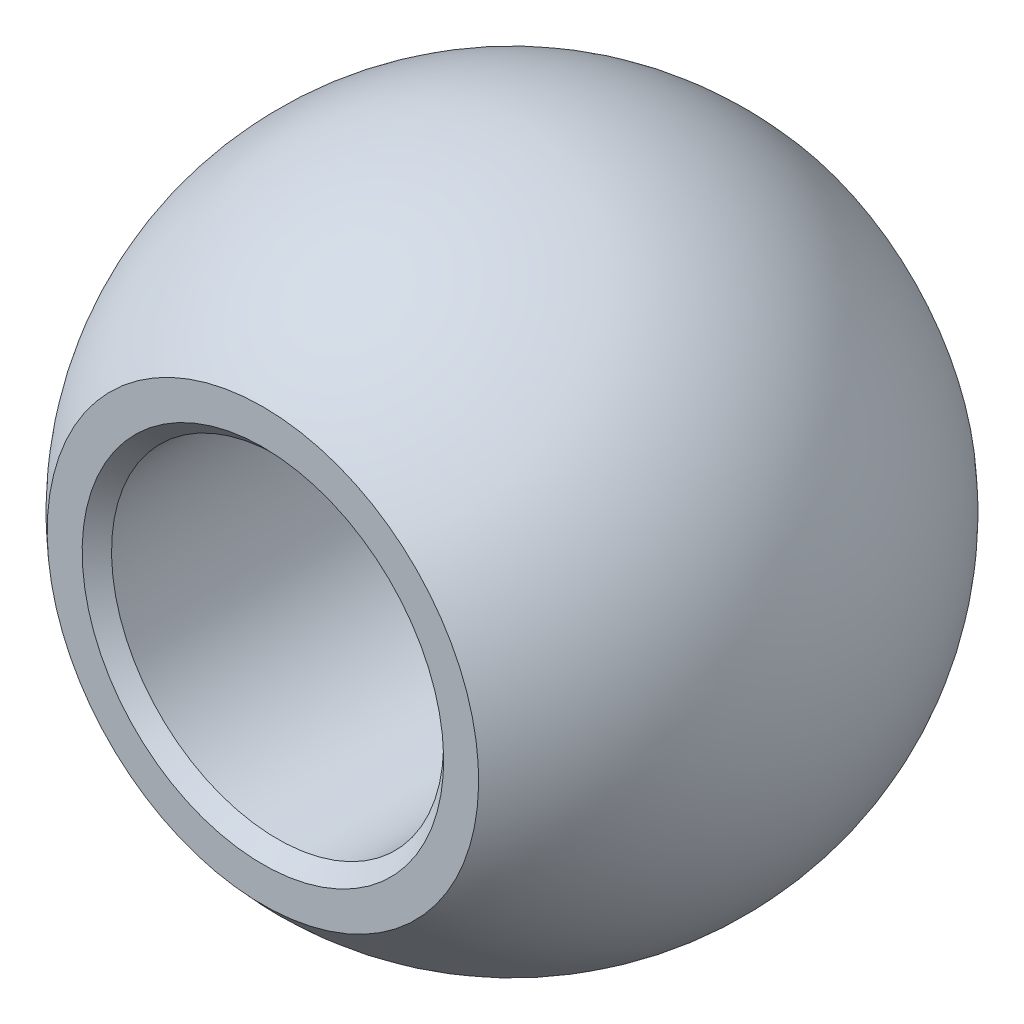
ISO-10303-21;
HEADER;
FILE_DESCRIPTION(('STEP AP214'),'2;1');
FILE_NAME('part.step','',(''),(''),'','','');
FILE_SCHEMA(('AUTOMOTIVE_DESIGN { 1 0 10303 214 1 1 1 1 }'));
ENDSEC;
DATA;
#1=APPLICATION_CONTEXT('core data for automotive mechanical design processes');
#2=APPLICATION_PROTOCOL_DEFINITION('international standard','automotive_design',2000,#1);
#3=PRODUCT_CONTEXT('',#1,'mechanical');
#4=PRODUCT('Part','Part','',(#3));
#5=PRODUCT_RELATED_PRODUCT_CATEGORY('part','',(#4));
#6=PRODUCT_DEFINITION_FORMATION('','',#4);
#7=PRODUCT_DEFINITION_CONTEXT('part definition',#1,'design');
#8=PRODUCT_DEFINITION('design','',#6,#7);
#9=PRODUCT_DEFINITION_SHAPE('','',#8);
#10=(LENGTH_UNIT() NAMED_UNIT(*) SI_UNIT(.MILLI.,.METRE.));
#11=(NAMED_UNIT(*) PLANE_ANGLE_UNIT() SI_UNIT($,.RADIAN.));
#12=(NAMED_UNIT(*) SI_UNIT($,.STERADIAN.) SOLID_ANGLE_UNIT());
#13=UNCERTAINTY_MEASURE_WITH_UNIT(LENGTH_MEASURE(1.E-05),#10,'distance_accuracy_value','');
#14=(GEOMETRIC_REPRESENTATION_CONTEXT(3) GLOBAL_UNCERTAINTY_ASSIGNED_CONTEXT((#13)) GLOBAL_UNIT_ASSIGNED_CONTEXT((#10,
#11,#12)) REPRESENTATION_CONTEXT('',''));
#15=CARTESIAN_POINT('',(0.,0.,0.));
#16=DIRECTION('',(0.,0.,1.));
#17=DIRECTION('',(1.,0.,0.));
#18=AXIS2_PLACEMENT_3D('',#15,#16,#17);
#19=CARTESIAN_POINT('',(0.,0.,0.));
#20=DIRECTION('',(0.,0.,-1.));
#21=DIRECTION('',(0.,1.,0.));
#22=AXIS2_PLACEMENT_3D('',#19,#20,#21);
#23=SPHERICAL_SURFACE('',#22,7.9375);
#24=CARTESIAN_POINT('',(0.,0.,6.));
#25=DIRECTION('',(0.,0.,-1.));
#26=DIRECTION('',(0.,1.,0.));
#27=AXIS2_PLACEMENT_3D('',#24,#25,#26);
#28=CIRCLE('',#27,5.19652828819395);
#29=CARTESIAN_POINT('',(0.,5.19652828819396,6.));
#30=VERTEX_POINT('',#29);
#31=EDGE_CURVE('E10',#30,#30,#28,.T.);
#32=CARTESIAN_POINT('',(0.,0.,-6.));
#33=DIRECTION('',(0.,0.,-1.));
#34=DIRECTION('',(0.,1.,0.));
#35=AXIS2_PLACEMENT_3D('',#32,#33,#34);
#36=CIRCLE('',#35,5.19652828819396);
#37=CARTESIAN_POINT('',(0.,5.19652828819396,-6.));
#38=VERTEX_POINT('',#37);
#39=EDGE_CURVE('E58',#38,#38,#36,.T.);
#40=CARTESIAN_POINT('',(0.,5.19652828819396,6.));
#41=CARTESIAN_POINT('',(0.,5.30366051736897,5.90721922322285));
#42=CARTESIAN_POINT('',(0.,5.40830248423484,5.81156370117377));
#43=CARTESIAN_POINT('',(0.,5.61231764773252,5.61478991259453));
#44=CARTESIAN_POINT('',(0.,5.71169084436433,5.51367164606436));
#45=CARTESIAN_POINT('',(0.,5.90488022177813,5.30625911458573));
#46=CARTESIAN_POINT('',(0.,5.99869640256011,5.19996484963726));
#47=CARTESIAN_POINT('',(0.,6.18050349258249,4.98250611345212));
#48=CARTESIAN_POINT('',(0.,6.26849440182288,4.87134164221545));
#49=CARTESIAN_POINT('',(0.,6.43839831775002,4.64446113071261));
#50=CARTESIAN_POINT('',(0.,6.52031132443676,4.52874509044645));
#51=CARTESIAN_POINT('',(0.,6.6778245294438,4.29309343576295));
#52=CARTESIAN_POINT('',(0.,6.7534247277641,4.17315782134562));
#53=CARTESIAN_POINT('',(0.,6.89809544059405,3.92941103630136));
#54=CARTESIAN_POINT('',(0.,6.96716595510371,3.80559986567444));
#55=CARTESIAN_POINT('',(0.,7.09857917612492,3.55445712481945));
#56=CARTESIAN_POINT('',(0.,7.16092188263647,3.42712555459138));
#57=CARTESIAN_POINT('',(0.,7.27870065658106,3.16930726360065));
#58=CARTESIAN_POINT('',(0.,7.3341367240141,3.03882054283799));
#59=CARTESIAN_POINT('',(0.,7.437943201897,2.77506625194003));
#60=CARTESIAN_POINT('',(0.,7.48631361234687,2.64179868180472));
#61=CARTESIAN_POINT('',(0.,7.57585002577664,2.37286496976655));
#62=CARTESIAN_POINT('',(0.,7.61701602875654,2.23719882786367));
#63=CARTESIAN_POINT('',(0.,7.6920255426921,1.96385713030413));
#64=CARTESIAN_POINT('',(0.,7.72586905364776,1.82618157464747));
#65=CARTESIAN_POINT('',(0.,7.78613650350182,1.54921597156258));
#66=CARTESIAN_POINT('',(0.,7.81256044240023,1.40992592413436));
#67=CARTESIAN_POINT('',(0.,7.85791295113851,1.13013089066224));
#68=CARTESIAN_POINT('',(0.,7.87684152097838,0.989625904618343));
#69=CARTESIAN_POINT('',(0.,7.9071489950437,0.707804032116979));
#70=CARTESIAN_POINT('',(0.,7.91852789926914,0.566487145659516));
#71=CARTESIAN_POINT('',(0.,7.93370340174729,0.283446839468035));
#72=CARTESIAN_POINT('',(0.,7.9375,0.141723419734018));
#73=CARTESIAN_POINT('',(0.,7.9375,-0.141723419734018));
#74=CARTESIAN_POINT('',(0.,7.93370340174729,-0.283446839468035));
#75=CARTESIAN_POINT('',(0.,7.91852789926914,-0.566487145659516));
#76=CARTESIAN_POINT('',(0.,7.9071489950437,-0.707804032116979));
#77=CARTESIAN_POINT('',(0.,7.87684152097838,-0.989625904618343));
#78=CARTESIAN_POINT('',(0.,7.85791295113851,-1.13013089066224));
#79=CARTESIAN_POINT('',(0.,7.81256044240023,-1.40992592413436));
#80=CARTESIAN_POINT('',(0.,7.78613650350182,-1.54921597156258));
#81=CARTESIAN_POINT('',(0.,7.72586905364776,-1.82618157464747));
#82=CARTESIAN_POINT('',(0.,7.6920255426921,-1.96385713030413));
#83=CARTESIAN_POINT('',(0.,7.61701602875654,-2.23719882786367));
#84=CARTESIAN_POINT('',(0.,7.57585002577664,-2.37286496976655));
#85=CARTESIAN_POINT('',(0.,7.48631361234687,-2.64179868180473));
#86=CARTESIAN_POINT('',(0.,7.437943201897,-2.77506625194003));
#87=CARTESIAN_POINT('',(0.,7.3341367240141,-3.03882054283799));
#88=CARTESIAN_POINT('',(0.,7.27870065658106,-3.16930726360065));
#89=CARTESIAN_POINT('',(0.,7.16092188263647,-3.42712555459138));
#90=CARTESIAN_POINT('',(0.,7.09857917612492,-3.55445712481945));
#91=CARTESIAN_POINT('',(0.,6.96716595510371,-3.80559986567444));
#92=CARTESIAN_POINT('',(0.,6.89809544059405,-3.92941103630136));
#93=CARTESIAN_POINT('',(0.,6.7534247277641,-4.17315782134562));
#94=CARTESIAN_POINT('',(0.,6.6778245294438,-4.29309343576295));
#95=CARTESIAN_POINT('',(0.,6.52031132443676,-4.52874509044645));
#96=CARTESIAN_POINT('',(0.,6.43839831775002,-4.64446113071261));
#97=CARTESIAN_POINT('',(0.,6.26849440182288,-4.87134164221545));
#98=CARTESIAN_POINT('',(0.,6.18050349258249,-4.98250611345212));
#99=CARTESIAN_POINT('',(0.,5.99869640256011,-5.19996484963726));
#100=CARTESIAN_POINT('',(0.,5.90488022177813,-5.30625911458573));
#101=CARTESIAN_POINT('',(0.,5.71169084436433,-5.51367164606436));
#102=CARTESIAN_POINT('',(0.,5.61231764773252,-5.61478991259453));
#103=CARTESIAN_POINT('',(0.,5.40830248423484,-5.81156370117377));
#104=CARTESIAN_POINT('',(0.,5.30366051736897,-5.90721922322285));
#105=CARTESIAN_POINT('',(0.,5.19652828819396,-6.));
#106=B_SPLINE_CURVE_WITH_KNOTS('',3,(#40,#41,#42,#43,#44,#45,#46,#47,#48,#49,#50,#51,#52,#53,
#54,#55,#56,#57,#58,#59,#60,#61,#62,#63,#64,#65,#66,#67,#68,#69,#70,#71,#72,#73,#74,#75,#76,#77,
#78,#79,#80,#81,#82,#83,#84,#85,#86,#87,#88,#89,#90,#91,#92,#93,#94,#95,#96,#97,#98,#99,#100,
#101,#102,#103,#104,#105),.UNSPECIFIED.,.F.,.F.,(4,2,2,2,2,2,2,2,2,2,2,2,2,2,2,2,2,2,2,2,2,2,2,
2,2,2,2,2,2,2,2,2,4),(0.,0.425119451662766,0.850238903325534,1.2753583549883,1.70047780665107,
2.12559725831383,2.5507167099766,2.97583616163937,3.40095561330213,3.8260750649649,
4.25119451662767,4.67631396829043,5.1014334199532,5.52655287161597,5.95167232327873,
6.3767917749415,6.80191122660427,7.22703067826703,7.6521501299298,8.07726958159257,
8.50238903325534,8.9275084849181,9.35262793658087,9.77774738824364,10.2028668399064,
10.6279862915692,11.0531057432319,11.4782251948947,11.9033446465575,12.3284640982202,
12.753583549883,13.1787030015458,13.6038224532085),.UNSPECIFIED.);
#107=EDGE_CURVE('BSEAM36',#30,#38,#106,.T.);
#108=ORIENTED_EDGE('',*,*,#31,.T.);
#109=ORIENTED_EDGE('',*,*,#39,.F.);
#110=ORIENTED_EDGE('',*,*,#107,.T.);
#111=ORIENTED_EDGE('',*,*,#107,.F.);
#112=EDGE_LOOP('',(#108,#110,#109,#111));
#113=FACE_BOUND('',#112,.T.);
#114=ADVANCED_FACE('F36',(#113),#23,.T.);
#115=CARTESIAN_POINT('',(0.,4.35364623631583,6.));
#116=DIRECTION('',(0.,0.,1.));
#117=DIRECTION('',(0.,-1.,0.));
#118=AXIS2_PLACEMENT_3D('',#115,#116,#117);
#119=PLANE('',#118);
#120=CARTESIAN_POINT('',(0.,0.,6.));
#121=DIRECTION('',(0.,0.,-1.));
#122=DIRECTION('',(0.,1.,0.));
#123=AXIS2_PLACEMENT_3D('',#120,#121,#122);
#124=CIRCLE('',#123,4.35364623631583);
#125=CARTESIAN_POINT('',(0.,4.35364623631583,6.));
#126=VERTEX_POINT('',#125);
#127=EDGE_CURVE('E42',#126,#126,#124,.T.);
#128=ORIENTED_EDGE('',*,*,#127,.T.);
#129=EDGE_LOOP('',(#128));
#130=FACE_BOUND('',#129,.T.);
#131=ORIENTED_EDGE('',*,*,#31,.F.);
#132=EDGE_LOOP('',(#131));
#133=FACE_BOUND('',#132,.T.);
#134=ADVANCED_FACE('F66',(#130,#133),#119,.T.);
#135=CARTESIAN_POINT('',(0.,0.,6.));
#136=DIRECTION('',(0.,0.,1.));
#137=DIRECTION('',(0.,-1.,0.));
#138=AXIS2_PLACEMENT_3D('',#135,#136,#137);
#139=CONICAL_SURFACE('',#138,4.35364623631583,0.785398163397447);
#140=CARTESIAN_POINT('',(0.,0.,5.64635376368417));
#141=DIRECTION('',(0.,0.,-1.));
#142=DIRECTION('',(0.,1.,0.));
#143=AXIS2_PLACEMENT_3D('',#140,#141,#142);
#144=CIRCLE('',#143,4.);
#145=CARTESIAN_POINT('',(0.,4.,5.64635376368417));
#146=VERTEX_POINT('',#145);
#147=EDGE_CURVE('E46',#146,#146,#144,.T.);
#148=ORIENTED_EDGE('',*,*,#147,.T.);
#149=EDGE_LOOP('',(#148));
#150=FACE_BOUND('',#149,.T.);
#151=ORIENTED_EDGE('',*,*,#127,.F.);
#152=EDGE_LOOP('',(#151));
#153=FACE_BOUND('',#152,.T.);
#154=ADVANCED_FACE('F70',(#150,#153),#139,.F.);
#155=CARTESIAN_POINT('',(0.,0.,0.));
#156=DIRECTION('',(0.,0.,-1.));
#157=DIRECTION('',(0.,1.,0.));
#158=AXIS2_PLACEMENT_3D('',#155,#156,#157);
#159=CYLINDRICAL_SURFACE('',#158,4.);
#160=CARTESIAN_POINT('',(0.,0.,-5.64635376368417));
#161=DIRECTION('',(0.,0.,-1.));
#162=DIRECTION('',(0.,1.,0.));
#163=AXIS2_PLACEMENT_3D('',#160,#161,#162);
#164=CIRCLE('',#163,4.);
#165=CARTESIAN_POINT('',(0.,4.,-5.64635376368417));
#166=VERTEX_POINT('',#165);
#167=EDGE_CURVE('E50',#166,#166,#164,.T.);
#168=ORIENTED_EDGE('',*,*,#167,.T.);
#169=EDGE_LOOP('',(#168));
#170=FACE_BOUND('',#169,.T.);
#171=ORIENTED_EDGE('',*,*,#147,.F.);
#172=EDGE_LOOP('',(#171));
#173=FACE_BOUND('',#172,.T.);
#174=ADVANCED_FACE('F74',(#170,#173),#159,.F.);
#175=CARTESIAN_POINT('',(0.,0.,-5.64635376368417));
#176=DIRECTION('',(0.,0.,-1.));
#177=DIRECTION('',(0.,1.,0.));
#178=AXIS2_PLACEMENT_3D('',#175,#176,#177);
#179=CONICAL_SURFACE('',#178,4.,0.78539816339745);
#180=CARTESIAN_POINT('',(0.,0.,-6.));
#181=DIRECTION('',(0.,0.,-1.));
#182=DIRECTION('',(0.,1.,0.));
#183=AXIS2_PLACEMENT_3D('',#180,#181,#182);
#184=CIRCLE('',#183,4.35364623631583);
#185=CARTESIAN_POINT('',(0.,4.35364623631583,-6.));
#186=VERTEX_POINT('',#185);
#187=EDGE_CURVE('E55',#186,#186,#184,.T.);
#188=ORIENTED_EDGE('',*,*,#187,.T.);
#189=EDGE_LOOP('',(#188));
#190=FACE_BOUND('',#189,.T.);
#191=ORIENTED_EDGE('',*,*,#167,.F.);
#192=EDGE_LOOP('',(#191));
#193=FACE_BOUND('',#192,.T.);
#194=ADVANCED_FACE('F81',(#190,#193),#179,.F.);
#195=CARTESIAN_POINT('',(0.,4.35364623631583,-6.));
#196=DIRECTION('',(0.,0.,-1.));
#197=DIRECTION('',(0.,1.,0.));
#198=AXIS2_PLACEMENT_3D('',#195,#196,#197);
#199=PLANE('',#198);
#200=ORIENTED_EDGE('',*,*,#39,.T.);
#201=EDGE_LOOP('',(#200));
#202=FACE_BOUND('',#201,.T.);
#203=ORIENTED_EDGE('',*,*,#187,.F.);
#204=EDGE_LOOP('',(#203));
#205=FACE_BOUND('',#204,.T.);
#206=ADVANCED_FACE('F62',(#202,#205),#199,.T.);
#207=CLOSED_SHELL('',(#114,#134,#154,#174,#194,#206));
#208=MANIFOLD_SOLID_BREP('B2',#207);
#209=ADVANCED_BREP_SHAPE_REPRESENTATION('',(#18,#208),#14);
#210=SHAPE_DEFINITION_REPRESENTATION(#9,#209);
ENDSEC;
END-ISO-10303-21;
